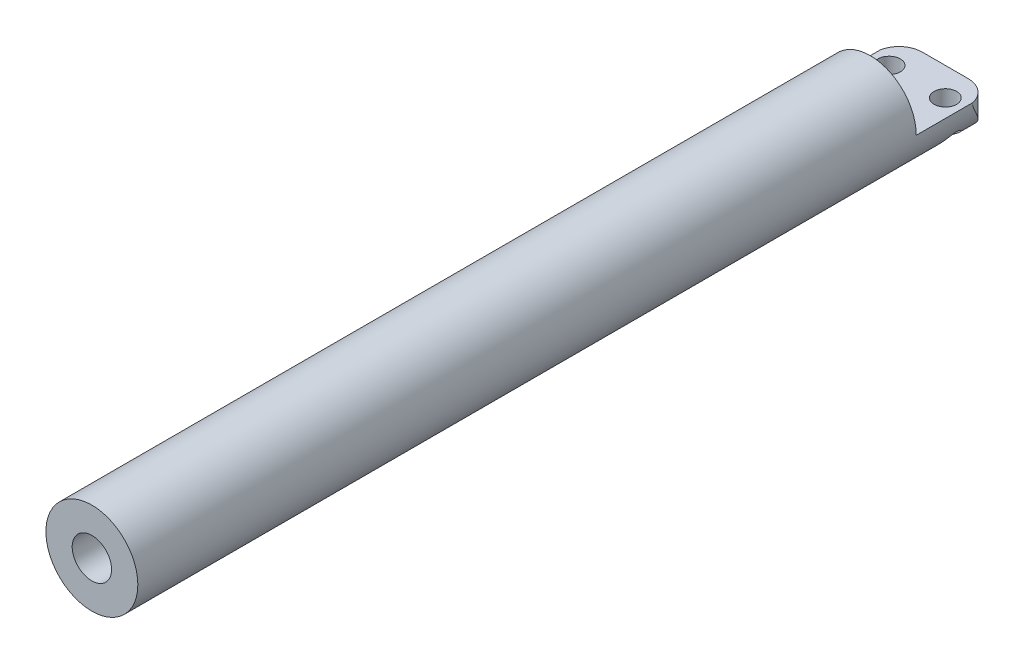
ISO-10303-21;
HEADER;
FILE_DESCRIPTION(('STEP AP214'),'2;1');
FILE_NAME('part.step','',(''),(''),'','','');
FILE_SCHEMA(('AUTOMOTIVE_DESIGN { 1 0 10303 214 1 1 1 1 }'));
ENDSEC;
DATA;
#1=APPLICATION_CONTEXT('core data for automotive mechanical design processes');
#2=APPLICATION_PROTOCOL_DEFINITION('international standard','automotive_design',2000,#1);
#3=PRODUCT_CONTEXT('',#1,'mechanical');
#4=PRODUCT('Part','Part','',(#3));
#5=PRODUCT_RELATED_PRODUCT_CATEGORY('part','',(#4));
#6=PRODUCT_DEFINITION_FORMATION('','',#4);
#7=PRODUCT_DEFINITION_CONTEXT('part definition',#1,'design');
#8=PRODUCT_DEFINITION('design','',#6,#7);
#9=PRODUCT_DEFINITION_SHAPE('','',#8);
#10=(LENGTH_UNIT() NAMED_UNIT(*) SI_UNIT(.MILLI.,.METRE.));
#11=(NAMED_UNIT(*) PLANE_ANGLE_UNIT() SI_UNIT($,.RADIAN.));
#12=(NAMED_UNIT(*) SI_UNIT($,.STERADIAN.) SOLID_ANGLE_UNIT());
#13=UNCERTAINTY_MEASURE_WITH_UNIT(LENGTH_MEASURE(1.E-05),#10,'distance_accuracy_value','');
#14=(GEOMETRIC_REPRESENTATION_CONTEXT(3) GLOBAL_UNCERTAINTY_ASSIGNED_CONTEXT((#13)) GLOBAL_UNIT_ASSIGNED_CONTEXT((#10,
#11,#12)) REPRESENTATION_CONTEXT('',''));
#15=CARTESIAN_POINT('',(0.,0.,0.));
#16=DIRECTION('',(0.,0.,1.));
#17=DIRECTION('',(1.,0.,0.));
#18=AXIS2_PLACEMENT_3D('',#15,#16,#17);
#19=CARTESIAN_POINT('',(5.,0.,8.));
#20=DIRECTION('',(0.,-1.,0.));
#21=DIRECTION('',(0.,0.,-1.));
#22=AXIS2_PLACEMENT_3D('',#19,#20,#21);
#23=PLANE('',#22);
#24=CARTESIAN_POINT('',(3.,0.,3.));
#25=DIRECTION('',(0.,1.,0.));
#26=DIRECTION('',(0.,0.,1.));
#27=AXIS2_PLACEMENT_3D('',#24,#25,#26);
#28=CIRCLE('',#27,1.2);
#29=CARTESIAN_POINT('',(3.,0.,4.2));
#30=VERTEX_POINT('',#29);
#31=EDGE_CURVE('E129',#30,#30,#28,.T.);
#32=ORIENTED_EDGE('',*,*,#31,.F.);
#33=EDGE_LOOP('',(#32));
#34=FACE_BOUND('',#33,.T.);
#35=DIRECTION('',(1.,0.,0.));
#36=VECTOR('',#35,1.);
#37=CARTESIAN_POINT('',(0.,0.,0.));
#38=LINE('',#37,#36);
#39=CARTESIAN_POINT('',(-2.45,0.,0.));
#40=VERTEX_POINT('',#39);
#41=CARTESIAN_POINT('',(2.45,0.,0.));
#42=VERTEX_POINT('',#41);
#43=EDGE_CURVE('E60',#40,#42,#38,.T.);
#44=ORIENTED_EDGE('',*,*,#43,.F.);
#45=CARTESIAN_POINT('',(-2.45,0.,2.5));
#46=DIRECTION('',(0.,-1.,0.));
#47=DIRECTION('',(0.,0.,-1.));
#48=AXIS2_PLACEMENT_3D('',#45,#46,#47);
#49=CIRCLE('',#48,2.5);
#50=CARTESIAN_POINT('',(-4.9,0.,2.00250628144669));
#51=VERTEX_POINT('',#50);
#52=EDGE_CURVE('E94',#51,#40,#49,.T.);
#53=ORIENTED_EDGE('',*,*,#52,.F.);
#54=DIRECTION('',(0.,0.,-1.));
#55=VECTOR('',#54,1.);
#56=CARTESIAN_POINT('',(-4.9,0.,91.));
#57=LINE('',#56,#55);
#58=CARTESIAN_POINT('',(-4.9,0.,8.00000000000001));
#59=VERTEX_POINT('',#58);
#60=EDGE_CURVE('E163',#59,#51,#57,.T.);
#61=ORIENTED_EDGE('',*,*,#60,.F.);
#62=DIRECTION('',(-1.,0.,0.));
#63=VECTOR('',#62,1.);
#64=CARTESIAN_POINT('',(5.,0.,8.));
#65=LINE('',#64,#63);
#66=CARTESIAN_POINT('',(4.9,0.,8.00000000000001));
#67=VERTEX_POINT('',#66);
#68=EDGE_CURVE('E151',#67,#59,#65,.T.);
#69=ORIENTED_EDGE('',*,*,#68,.F.);
#70=DIRECTION('',(0.,0.,-1.));
#71=VECTOR('',#70,1.);
#72=CARTESIAN_POINT('',(4.9,0.,91.));
#73=LINE('',#72,#71);
#74=CARTESIAN_POINT('',(4.9,0.,2.0025062814467));
#75=VERTEX_POINT('',#74);
#76=EDGE_CURVE('E160',#75,#67,#73,.F.);
#77=ORIENTED_EDGE('',*,*,#76,.F.);
#78=CARTESIAN_POINT('',(2.45,0.,2.5));
#79=DIRECTION('',(0.,-1.,0.));
#80=DIRECTION('',(0.,0.,-1.));
#81=AXIS2_PLACEMENT_3D('',#78,#79,#80);
#82=CIRCLE('',#81,2.5);
#83=EDGE_CURVE('E114',#42,#75,#82,.T.);
#84=ORIENTED_EDGE('',*,*,#83,.F.);
#85=EDGE_LOOP('',(#44,#53,#61,#69,#77,#84));
#86=FACE_BOUND('',#85,.T.);
#87=CARTESIAN_POINT('',(-3.,0.,3.));
#88=DIRECTION('',(0.,1.,0.));
#89=DIRECTION('',(0.,0.,1.));
#90=AXIS2_PLACEMENT_3D('',#87,#88,#89);
#91=CIRCLE('',#90,1.2);
#92=CARTESIAN_POINT('',(-3.,0.,4.2));
#93=VERTEX_POINT('',#92);
#94=EDGE_CURVE('E223',#93,#93,#91,.T.);
#95=ORIENTED_EDGE('',*,*,#94,.F.);
#96=EDGE_LOOP('',(#95));
#97=FACE_BOUND('',#96,.T.);
#98=ADVANCED_FACE('F45',(#34,#86,#97),#23,.F.);
#99=CARTESIAN_POINT('',(0.,0.,0.));
#100=DIRECTION('',(0.,0.,1.));
#101=DIRECTION('',(1.,0.,0.));
#102=AXIS2_PLACEMENT_3D('',#99,#100,#101);
#103=PLANE('',#102);
#104=DIRECTION('',(0.,1.,0.));
#105=VECTOR('',#104,1.);
#106=CARTESIAN_POINT('',(-2.45,-4.9,0.));
#107=LINE('',#106,#105);
#108=CARTESIAN_POINT('',(-2.45,-4.24352447854375,0.));
#109=VERTEX_POINT('',#108);
#110=EDGE_CURVE('E97',#109,#40,#107,.T.);
#111=ORIENTED_EDGE('',*,*,#110,.T.);
#112=ORIENTED_EDGE('',*,*,#43,.T.);
#113=DIRECTION('',(0.,1.,0.));
#114=VECTOR('',#113,1.);
#115=CARTESIAN_POINT('',(2.45,-4.9,0.));
#116=LINE('',#115,#114);
#117=CARTESIAN_POINT('',(2.45,-4.24352447854375,0.));
#118=VERTEX_POINT('',#117);
#119=EDGE_CURVE('E76',#118,#42,#116,.T.);
#120=ORIENTED_EDGE('',*,*,#119,.F.);
#121=CARTESIAN_POINT('',(0.,0.,0.));
#122=DIRECTION('',(0.,0.,1.));
#123=DIRECTION('',(1.,0.,0.));
#124=AXIS2_PLACEMENT_3D('',#121,#122,#123);
#125=CIRCLE('',#124,4.9);
#126=EDGE_CURVE('E108',#109,#118,#125,.T.);
#127=ORIENTED_EDGE('',*,*,#126,.F.);
#128=EDGE_LOOP('',(#111,#112,#120,#127));
#129=FACE_BOUND('',#128,.T.);
#130=ADVANCED_FACE('F106',(#129),#103,.F.);
#131=CARTESIAN_POINT('',(0.,0.,91.));
#132=DIRECTION('',(0.,0.,-1.));
#133=DIRECTION('',(-1.,0.,0.));
#134=AXIS2_PLACEMENT_3D('',#131,#132,#133);
#135=CYLINDRICAL_SURFACE('',#134,4.9);
#136=CARTESIAN_POINT('',(-3.,-3.87427412556211,4.2));
#137=CARTESIAN_POINT('',(-2.91894319230574,-3.93703894208136,4.20000005116718));
#138=CARTESIAN_POINT('',(-2.83585725052486,-3.99727138144049,4.19180123097966));
#139=CARTESIAN_POINT('',(-2.66884426469863,-4.1106421312578,4.15653426329772));
#140=CARTESIAN_POINT('',(-2.58491953907667,-4.16379612844909,4.1295086960665));
#141=CARTESIAN_POINT('',(-2.44554988663214,-4.24662262416049,4.06610566093395));
#142=CARTESIAN_POINT('',(-2.38907540609704,-4.27857057943195,4.03492044222271));
#143=CARTESIAN_POINT('',(-2.28021240888101,-4.33756262033138,3.96237900729422));
#144=CARTESIAN_POINT('',(-2.22782173934737,-4.36460929985309,3.92102819846337));
#145=CARTESIAN_POINT('',(-2.12922471820036,-4.41355373883355,3.82845851160823));
#146=CARTESIAN_POINT('',(-2.08304768738188,-4.43542743178192,3.77719545098181));
#147=CARTESIAN_POINT('',(-1.99947023195381,-4.47372782754513,3.66615567480207));
#148=CARTESIAN_POINT('',(-1.96206811020355,-4.49015558390385,3.60638060914139));
#149=CARTESIAN_POINT('',(-1.90064575916992,-4.51647801721775,3.48542579725053));
#150=CARTESIAN_POINT('',(-1.87577598336144,-4.52679991937303,3.42476895091964));
#151=CARTESIAN_POINT('',(-1.83617206748828,-4.54300943211008,3.29967447676053));
#152=CARTESIAN_POINT('',(-1.82143511467273,-4.54889827329981,3.23523790353405));
#153=CARTESIAN_POINT('',(-1.80312853798517,-4.55618484085379,3.10726649978699));
#154=CARTESIAN_POINT('',(-1.79912560716684,-4.55775689203799,3.04380311221458));
#155=CARTESIAN_POINT('',(-1.80119335927167,-4.55694021470691,2.91706969172011));
#156=CARTESIAN_POINT('',(-1.80726293067784,-4.55455192322189,2.8537996382352));
#157=CARTESIAN_POINT('',(-1.82912526400739,-4.54581515503182,2.72985967378321));
#158=CARTESIAN_POINT('',(-1.84482706689199,-4.53950371803653,2.66917105250077));
#159=CARTESIAN_POINT('',(-1.88524159149435,-4.52286836726616,2.55146272782724));
#160=CARTESIAN_POINT('',(-1.90995404930511,-4.51254457100577,2.49444291704037));
#161=CARTESIAN_POINT('',(-1.96766221214069,-4.48768276618114,2.38507165821778));
#162=CARTESIAN_POINT('',(-2.00073233039107,-4.47310670695859,2.33276820376856));
#163=CARTESIAN_POINT('',(-2.07369865066958,-4.43974986032653,2.23468722320652));
#164=CARTESIAN_POINT('',(-2.11359537837127,-4.42096874907845,2.18891020015047));
#165=CARTESIAN_POINT('',(-2.20022491935629,-4.37851742829536,2.10322482264729));
#166=CARTESIAN_POINT('',(-2.24715419742306,-4.35469369806591,2.06359189605251));
#167=CARTESIAN_POINT('',(-2.34489168390561,-4.30285298835708,1.99278643218186));
#168=CARTESIAN_POINT('',(-2.39570090905638,-4.27483490789369,1.96161612233888));
#169=CARTESIAN_POINT('',(-2.50394323549686,-4.21242096966201,1.90548867901903));
#170=CARTESIAN_POINT('',(-2.56157139565156,-4.17768474333821,1.88128981955732));
#171=CARTESIAN_POINT('',(-2.67755821287268,-4.10431507289855,1.84251241762814));
#172=CARTESIAN_POINT('',(-2.73591725443182,-4.06567949494166,1.82793917585243));
#173=CARTESIAN_POINT('',(-2.8606749148685,-3.97908695377834,1.80619076501843));
#174=CARTESIAN_POINT('',(-2.92695753114289,-3.93060322834648,1.8004641696216));
#175=CARTESIAN_POINT('',(-3.05699611157354,-3.83034380229779,1.79958947214933));
#176=CARTESIAN_POINT('',(-3.12075129362828,-3.77856709539524,1.80444461892108));
#177=CARTESIAN_POINT('',(-3.25756972377173,-3.66168167477498,1.82552539633807));
#178=CARTESIAN_POINT('',(-3.32983455209164,-3.59602866216794,1.84389302638762));
#179=CARTESIAN_POINT('',(-3.46834162568086,-3.46263981821649,1.89272126997221));
#180=CARTESIAN_POINT('',(-3.5345706989209,-3.39489984375281,1.92320758872699));
#181=CARTESIAN_POINT('',(-3.63530300512277,-3.28598610675153,1.98102974139632));
#182=CARTESIAN_POINT('',(-3.67198853775232,-3.24490876541021,2.00483713171172));
#183=CARTESIAN_POINT('',(-3.74274419435274,-3.16303462657827,2.0564696751072));
#184=CARTESIAN_POINT('',(-3.77681509337203,-3.1222377492406,2.0842936304674));
#185=CARTESIAN_POINT('',(-3.84212726018961,-3.04150441133421,2.14397680221198));
#186=CARTESIAN_POINT('',(-3.87337392361417,-3.00156642615875,2.17582803266554));
#187=CARTESIAN_POINT('',(-3.93286434576907,-2.92318201536295,2.24382285441116));
#188=CARTESIAN_POINT('',(-3.96111082374422,-2.88473425948738,2.27996249485316));
#189=CARTESIAN_POINT('',(-4.01232772500763,-2.81300991666482,2.35418550865248));
#190=CARTESIAN_POINT('',(-4.03553224425234,-2.77956052905598,2.39193768218171));
#191=CARTESIAN_POINT('',(-4.0785529536903,-2.71603965789004,2.47199727583275));
#192=CARTESIAN_POINT('',(-4.0983712731116,-2.68596605576517,2.51430180597117));
#193=CARTESIAN_POINT('',(-4.13086980905536,-2.63565199417995,2.59657111385787));
#194=CARTESIAN_POINT('',(-4.14418765001887,-2.61460775937328,2.63578162392659));
#195=CARTESIAN_POINT('',(-4.16709039770135,-2.57795010788273,2.71769395378718));
#196=CARTESIAN_POINT('',(-4.17668311889779,-2.56232532981767,2.76038823505305));
#197=CARTESIAN_POINT('',(-4.18962820841895,-2.54108952922403,2.83877612464222));
#198=CARTESIAN_POINT('',(-4.19389332322885,-2.53402526257945,2.87391879647768));
#199=CARTESIAN_POINT('',(-4.19927244021785,-2.52510198069445,2.94509049809449));
#200=CARTESIAN_POINT('',(-4.20038945806425,-2.52323798395897,2.98111864624471));
#201=CARTESIAN_POINT('',(-4.19936778151055,-2.52493775739384,3.05301626390913));
#202=CARTESIAN_POINT('',(-4.19722719513464,-2.52850468177588,3.0888856290675));
#203=CARTESIAN_POINT('',(-4.18989057196289,-2.54064274093599,3.15944635655077));
#204=CARTESIAN_POINT('',(-4.1846913081904,-2.54921916078152,3.19413643375148));
#205=CARTESIAN_POINT('',(-4.16929611469619,-2.57434518939374,3.27372493798174));
#206=CARTESIAN_POINT('',(-4.15797889571629,-2.59264834396757,3.317845163586));
#207=CARTESIAN_POINT('',(-4.13147489908584,-2.63467944342404,3.40215578782995));
#208=CARTESIAN_POINT('',(-4.11627833806198,-2.65842108794419,3.44233588986658));
#209=CARTESIAN_POINT('',(-4.07204112004904,-2.7259813117342,3.54356030021408));
#210=CARTESIAN_POINT('',(-4.04038765079597,-2.77288251057112,3.60137581169563));
#211=CARTESIAN_POINT('',(-3.97078296128257,-2.87168528805593,3.70827787793948));
#212=CARTESIAN_POINT('',(-3.93281406548323,-2.92360072449348,3.75733910918079));
#213=CARTESIAN_POINT('',(-3.86130766271513,-3.01709970669626,3.83682108860561));
#214=CARTESIAN_POINT('',(-3.82889967623743,-3.05816618149949,3.86888746754464));
#215=CARTESIAN_POINT('',(-3.7612126692087,-3.14104300949098,3.92876175619676));
#216=CARTESIAN_POINT('',(-3.72593223693857,-3.18285372046467,3.95656755238033));
#217=CARTESIAN_POINT('',(-3.61607167706204,-3.30852584273501,4.03366655739079));
#218=CARTESIAN_POINT('',(-3.53737913727735,-3.39275115756542,4.07674315841821));
#219=CARTESIAN_POINT('',(-3.38425034701718,-3.54492944931914,4.13929589508668));
#220=CARTESIAN_POINT('',(-3.31128423083506,-3.61325831801122,4.16150617637717));
#221=CARTESIAN_POINT('',(-3.1595495699747,-3.74665404155835,4.19185642570665));
#222=CARTESIAN_POINT('',(-3.08078249669078,-3.81172171661592,4.19999994900598));
#223=CARTESIAN_POINT('',(-3.,-3.87427412556211,4.2));
#224=B_SPLINE_CURVE_WITH_KNOTS('',3,(#136,#137,#138,#139,#140,#141,#142,#143,#144,#145,#146,
#147,#148,#149,#150,#151,#152,#153,#154,#155,#156,#157,#158,#159,#160,#161,#162,#163,#164,#165,
#166,#167,#168,#169,#170,#171,#172,#173,#174,#175,#176,#177,#178,#179,#180,#181,#182,#183,#184,
#185,#186,#187,#188,#189,#190,#191,#192,#193,#194,#195,#196,#197,#198,#199,#200,#201,#202,#203,
#204,#205,#206,#207,#208,#209,#210,#211,#212,#213,#214,#215,#216,#217,#218,#219,#220,#221,#222,
#223),.UNSPECIFIED.,.T.,.F.,(4,2,2,2,2,2,2,2,2,2,2,2,2,2,2,2,2,2,2,2,2,2,2,2,2,2,2,2,2,2,2,2,2,
2,2,2,2,2,2,2,2,2,2,4),(0.,0.307170967446051,0.613649455443194,0.8287323111983,1.04370100446146,
1.25965095245849,1.47555909943732,1.67365157254986,1.87168903532938,2.06160260155836,
2.2514952119102,2.43962165862984,2.62774259588358,2.81760143196876,3.00747489445377,
3.20428358245072,3.40114402206238,3.61482212204078,3.82861779364279,4.07468175591704,
4.32082127633762,4.61781564999811,4.91544337553835,5.0952772710543,5.27505765134011,
5.45448696654532,5.6337522411303,5.80001279483082,5.96616841676184,6.1050721485401,
6.24368289625694,6.35151115216559,6.45923608061749,6.56702359824286,6.67492503869311,
6.8213574189653,6.96816280186745,7.20951660617485,7.45155763969488,7.63540287253664,
7.81933901150218,8.18666135813135,8.49287020622753,8.79900165116191),.UNSPECIFIED.);
#225=CARTESIAN_POINT('',(-3.,-3.87427412556211,4.2));
#226=VERTEX_POINT('',#225);
#227=EDGE_CURVE('E50',#226,#226,#224,.T.);
#228=ORIENTED_EDGE('',*,*,#227,.T.);
#229=EDGE_LOOP('',(#228));
#230=FACE_BOUND('',#229,.T.);
#231=CARTESIAN_POINT('',(3.,-3.8742741255621,4.2));
#232=CARTESIAN_POINT('',(3.08029401161625,-3.81209543093405,4.20000034014652));
#233=CARTESIAN_POINT('',(3.15865368673556,-3.74739481534197,4.19194837608926));
#234=CARTESIAN_POINT('',(3.3097373852026,-3.6146644807967,4.16190163261985));
#235=CARTESIAN_POINT('',(3.38245169767743,-3.54662934005454,4.13988340054288));
#236=CARTESIAN_POINT('',(3.52793539608425,-3.40222950792458,4.08075817666281));
#237=CARTESIAN_POINT('',(3.60002450275473,-3.32569749652787,4.04239362743198));
#238=CARTESIAN_POINT('',(3.73532226529907,-3.17297066049489,3.95181022319879));
#239=CARTESIAN_POINT('',(3.79853420661298,-3.09677572127355,3.89959651454928));
#240=CARTESIAN_POINT('',(3.89745577038225,-2.97055723229464,3.79871253244432));
#241=CARTESIAN_POINT('',(3.93571073895858,-2.91957022269414,3.75372156050752));
#242=CARTESIAN_POINT('',(4.00669825417587,-2.82134777868147,3.65590508874435));
#243=CARTESIAN_POINT('',(4.03943969824603,-2.77410636631574,3.60309247506956));
#244=CARTESIAN_POINT('',(4.08783531616308,-2.70199796625347,3.50830628036876));
#245=CARTESIAN_POINT('',(4.10547469152316,-2.67505851479824,3.46893852358465));
#246=CARTESIAN_POINT('',(4.13709428526058,-2.62589014492219,3.3859792539165));
#247=CARTESIAN_POINT('',(4.15108067049547,-2.60365329995567,3.34239503188358));
#248=CARTESIAN_POINT('',(4.1715504680159,-2.57069077431611,3.26218438199564));
#249=CARTESIAN_POINT('',(4.17903085096306,-2.55848131530613,3.22643344951474));
#250=CARTESIAN_POINT('',(4.19077492844687,-2.5391996494995,3.15306698792748));
#251=CARTESIAN_POINT('',(4.19504324852174,-2.53212005597666,3.11545422352712));
#252=CARTESIAN_POINT('',(4.19997687583845,-2.52392950372323,3.03907288537));
#253=CARTESIAN_POINT('',(4.2006184331558,-2.52285788872902,3.00029836071458));
#254=CARTESIAN_POINT('',(4.19816186255342,-2.52694305217911,2.92319611174113));
#255=CARTESIAN_POINT('',(4.19506168445216,-2.53210324517299,2.88486864399773));
#256=CARTESIAN_POINT('',(4.18487670038458,-2.54890384761461,2.80543199332854));
#257=CARTESIAN_POINT('',(4.17736466386615,-2.56123741397074,2.76452864679813));
#258=CARTESIAN_POINT('',(4.158796986287,-2.59127740295743,2.68560884936631));
#259=CARTESIAN_POINT('',(4.14773446197969,-2.60899425845976,2.64759818499134));
#260=CARTESIAN_POINT('',(4.11590422645581,-2.65906301650473,2.5546601192218));
#261=CARTESIAN_POINT('',(4.09314176843861,-2.69411136984665,2.50189317992721));
#262=CARTESIAN_POINT('',(4.04248662753396,-2.76954589342526,2.40307649852652));
#263=CARTESIAN_POINT('',(4.01457964047652,-2.80994685603532,2.35704614371809));
#264=CARTESIAN_POINT('',(3.95967788492703,-2.88665666020806,2.27825993584587));
#265=CARTESIAN_POINT('',(3.93333430012126,-2.9224938568744,2.24457762521559));
#266=CARTESIAN_POINT('',(3.87804063899718,-2.99548059145864,2.18096347346174));
#267=CARTESIAN_POINT('',(3.84908897268007,-3.03263092141911,2.15103394715345));
#268=CARTESIAN_POINT('',(3.75858001375491,-3.145204868798,2.06651797268458));
#269=CARTESIAN_POINT('',(3.69337807448052,-3.22173818085064,2.01721708718196));
#270=CARTESIAN_POINT('',(3.55145724456577,-3.3776846700294,1.93085812109448));
#271=CARTESIAN_POINT('',(3.4743770862964,-3.45708799204735,1.89438138886364));
#272=CARTESIAN_POINT('',(3.31181623494424,-3.61310156443419,1.83804278502768));
#273=CARTESIAN_POINT('',(3.22634813542747,-3.68971577223398,1.81815641875024));
#274=CARTESIAN_POINT('',(3.06663453138492,-3.82286666311273,1.79972598434529));
#275=CARTESIAN_POINT('',(2.99358044311198,-3.8803463414999,1.79769891648557));
#276=CARTESIAN_POINT('',(2.84491454405354,-3.99061143916833,1.8077413813));
#277=CARTESIAN_POINT('',(2.76930593356559,-4.04340245183973,1.81979386781202));
#278=CARTESIAN_POINT('',(2.63092269779273,-4.13447962474159,1.85631982669513));
#279=CARTESIAN_POINT('',(2.56813198170949,-4.1737110652616,1.87835850838576));
#280=CARTESIAN_POINT('',(2.4447446618623,-4.24715989701134,1.93404292549753));
#281=CARTESIAN_POINT('',(2.38414735213289,-4.2813789125309,1.96768488893635));
#282=CARTESIAN_POINT('',(2.26740933587002,-4.34433964494003,2.04694340893176));
#283=CARTESIAN_POINT('',(2.21129929631278,-4.37304528704025,2.0926344799132));
#284=CARTESIAN_POINT('',(2.10694234981461,-4.42427186512402,2.19514799622031));
#285=CARTESIAN_POINT('',(2.05869149998859,-4.44679590627046,2.25196482814724));
#286=CARTESIAN_POINT('',(1.9777912580084,-4.48331234335294,2.36793646346695));
#287=CARTESIAN_POINT('',(1.9439865360377,-4.49798746241129,2.42607345587645));
#288=CARTESIAN_POINT('',(1.88632835259946,-4.52247194167801,2.54802863389412));
#289=CARTESIAN_POINT('',(1.86247089625175,-4.5322832555188,2.61184452630416));
#290=CARTESIAN_POINT('',(1.82702308253782,-4.54668340496262,2.73886309629125));
#291=CARTESIAN_POINT('',(1.81474161782269,-4.551567899346,2.80184055470478));
#292=CARTESIAN_POINT('',(1.80038499451117,-4.55726625131094,2.92912612841131));
#293=CARTESIAN_POINT('',(1.79830809333312,-4.55808080389627,2.99343401463027));
#294=CARTESIAN_POINT('',(1.80438511766255,-4.55567811863927,3.12023934409444));
#295=CARTESIAN_POINT('',(1.81234273238644,-4.55253824490808,3.18274779928398));
#296=CARTESIAN_POINT('',(1.83783344392526,-4.54230721225471,3.30544068654007));
#297=CARTESIAN_POINT('',(1.85536605488324,-4.53521625381915,3.36562523636093));
#298=CARTESIAN_POINT('',(1.8993412248719,-4.51697537198676,3.48211329265415));
#299=CARTESIAN_POINT('',(1.92580009208096,-4.50581801630566,3.53840946666019));
#300=CARTESIAN_POINT('',(1.98654679121136,-4.47936656023999,3.64552653851655));
#301=CARTESIAN_POINT('',(2.02083472755959,-4.46407240467682,3.69634736332142));
#302=CARTESIAN_POINT('',(2.09675519524313,-4.42892787015135,3.79245560939518));
#303=CARTESIAN_POINT('',(2.13854048816487,-4.40897946894962,3.83758617230608));
#304=CARTESIAN_POINT('',(2.22722978372662,-4.36484808451045,3.92005235640736));
#305=CARTESIAN_POINT('',(2.27413486493304,-4.34066420835033,3.95738633027524));
#306=CARTESIAN_POINT('',(2.37444078064016,-4.286661902678,4.02596084152474));
#307=CARTESIAN_POINT('',(2.42806469864344,-4.25658440547127,4.0566689939238));
#308=CARTESIAN_POINT('',(2.53730851399873,-4.19238410334429,4.10886729437353));
#309=CARTESIAN_POINT('',(2.59292902498088,-4.158260047208,4.13035458175162));
#310=CARTESIAN_POINT('',(2.70775245480676,-4.08448158223328,4.16550356804713));
#311=CARTESIAN_POINT('',(2.76697964206467,-4.04462328294602,4.17865232515285));
#312=CARTESIAN_POINT('',(2.88446624609577,-3.96169668231821,4.19590237742974));
#313=CARTESIAN_POINT('',(2.94272523325808,-3.91862700019689,4.19999975736905));
#314=CARTESIAN_POINT('',(3.,-3.8742741255621,4.2));
#315=B_SPLINE_CURVE_WITH_KNOTS('',3,(#231,#232,#233,#234,#235,#236,#237,#238,#239,#240,#241,
#242,#243,#244,#245,#246,#247,#248,#249,#250,#251,#252,#253,#254,#255,#256,#257,#258,#259,#260,
#261,#262,#263,#264,#265,#266,#267,#268,#269,#270,#271,#272,#273,#274,#275,#276,#277,#278,#279,
#280,#281,#282,#283,#284,#285,#286,#287,#288,#289,#290,#291,#292,#293,#294,#295,#296,#297,#298,
#299,#300,#301,#302,#303,#304,#305,#306,#307,#308,#309,#310,#311,#312,#313,#314),.UNSPECIFIED.,
.T.,.F.,(4,2,2,2,2,2,2,2,2,2,2,2,2,2,2,2,2,2,2,2,2,2,2,2,2,2,2,2,2,2,2,2,2,2,2,2,2,2,2,2,2,4),
(0.,0.304419972637567,0.609352496585275,0.943894977585928,1.27831331621934,1.51188892452681,
1.74508391186346,1.89728932419934,2.04923610284688,2.16433861872038,2.2792750620946,
2.39496330470807,2.51071496431526,2.64013284051597,2.76980314720873,2.97061696544059,
3.17199779938875,3.33914978794049,3.50640437823084,3.84097510738331,4.18919166705855,
4.53689319157126,4.81479454279972,5.09235978636246,5.32316105658555,5.55388736878634,
5.78607544214613,6.0181466676298,6.22356675601705,6.42890426684473,6.62101688878945,
6.8130967034937,7.00147638953361,7.18984651765022,7.37856267676796,7.56728135319544,
7.76040529142772,7.95356999315927,8.15890979418428,8.36431325366384,8.58136612515845,
8.79851286591079),.UNSPECIFIED.);
#316=CARTESIAN_POINT('',(3.,-3.8742741255621,4.2));
#317=VERTEX_POINT('',#316);
#318=EDGE_CURVE('E122',#317,#317,#315,.T.);
#319=ORIENTED_EDGE('',*,*,#318,.T.);
#320=EDGE_LOOP('',(#319));
#321=FACE_BOUND('',#320,.T.);
#322=CARTESIAN_POINT('',(0.,0.,91.));
#323=DIRECTION('',(0.,0.,1.));
#324=DIRECTION('',(1.,0.,0.));
#325=AXIS2_PLACEMENT_3D('',#322,#323,#324);
#326=CIRCLE('',#325,4.9);
#327=CARTESIAN_POINT('',(4.9,0.,91.));
#328=VERTEX_POINT('',#327);
#329=EDGE_CURVE('E116',#328,#328,#326,.T.);
#330=ORIENTED_EDGE('',*,*,#329,.F.);
#331=EDGE_LOOP('',(#330));
#332=FACE_BOUND('',#331,.T.);
#333=ORIENTED_EDGE('',*,*,#60,.T.);
#334=CARTESIAN_POINT('',(-4.9,0.,2.0025062814467));
#335=CARTESIAN_POINT('',(-4.90000556065781,-0.0378187681741099,2.00257911082401));
#336=CARTESIAN_POINT('',(-4.89956250368469,-0.0755745786032973,2.00034931964881));
#337=CARTESIAN_POINT('',(-4.89783107814846,-0.150432496507789,1.99191262520152));
#338=CARTESIAN_POINT('',(-4.89654707932557,-0.187536970617807,1.98572628500967));
#339=CARTESIAN_POINT('',(-4.89321190903408,-0.260368231638872,1.97011987955992));
#340=CARTESIAN_POINT('',(-4.89117346444097,-0.296107590990815,1.96075366159133));
#341=CARTESIAN_POINT('',(-4.88637922648787,-0.366812742082446,1.93948283692182));
#342=CARTESIAN_POINT('',(-4.88362243188157,-0.40177737960784,1.92757469146888));
#343=CARTESIAN_POINT('',(-4.87148169806141,-0.537622939133123,1.87720429080218));
#344=CARTESIAN_POINT('',(-4.85956655379192,-0.63564771858297,1.83180282189697));
#345=CARTESIAN_POINT('',(-4.8305567932521,-0.827741998927642,1.73476820379137));
#346=CARTESIAN_POINT('',(-4.81344969285037,-0.921801337032413,1.68312021682083));
#347=CARTESIAN_POINT('',(-4.77376937752847,-1.10926572565132,1.57619638218655));
#348=CARTESIAN_POINT('',(-4.75109345227172,-1.20261985316768,1.52086856119421));
#349=CARTESIAN_POINT('',(-4.70048086126002,-1.38731123058661,1.40954905486917));
#350=CARTESIAN_POINT('',(-4.67255005957093,-1.47865060307894,1.35355817410723));
#351=CARTESIAN_POINT('',(-4.5961191807792,-1.7047487267428,1.21421586898528));
#352=CARTESIAN_POINT('',(-4.54429294682562,-1.83854098643578,1.1310871142022));
#353=CARTESIAN_POINT('',(-4.42819718992264,-2.10283196419191,0.968081260253986));
#354=CARTESIAN_POINT('',(-4.363918673074,-2.23332822418167,0.888206562167163));
#355=CARTESIAN_POINT('',(-4.22294718983162,-2.48956663175685,0.734365324265328));
#356=CARTESIAN_POINT('',(-4.14634644927922,-2.61533613814375,0.660360561461452));
#357=CARTESIAN_POINT('',(-3.97998233978338,-2.86214324964053,0.519848533241593));
#358=CARTESIAN_POINT('',(-3.89022999307804,-2.98318471072488,0.45333507120003));
#359=CARTESIAN_POINT('',(-3.67774156950639,-3.24310959917855,0.317899146250395));
#360=CARTESIAN_POINT('',(-3.55199933972218,-3.38071455262972,0.251159542929593));
#361=CARTESIAN_POINT('',(-3.2810952236416,-3.64415696282402,0.137642571786041));
#362=CARTESIAN_POINT('',(-3.13599667297245,-3.77003061540654,0.0908020998678496));
#363=CARTESIAN_POINT('',(-2.89831948748289,-3.95232826413879,0.0390343566678932));
#364=CARTESIAN_POINT('',(-2.81195298070453,-4.01425332245867,0.024734386048503));
#365=CARTESIAN_POINT('',(-2.63438034379824,-4.13298264151104,0.00520324003111501));
#366=CARTESIAN_POINT('',(-2.54315874606574,-4.18976876097348,3.08816464852921E-06));
#367=CARTESIAN_POINT('',(-2.45,-4.24352447854375,0.));
#368=B_SPLINE_CURVE_WITH_KNOTS('',3,(#334,#335,#336,#337,#338,#339,#340,#341,#342,#343,#344,
#345,#346,#347,#348,#349,#350,#351,#352,#353,#354,#355,#356,#357,#358,#359,#360,#361,#362,#363,
#364,#365,#366,#367),.UNSPECIFIED.,.F.,.F.,(4,2,2,2,2,2,2,2,2,2,2,2,2,2,2,2,4),(0.,
0.113287945607553,0.225991840513201,0.336875269053001,0.447914082945231,0.772991806485276,
1.09885746143025,1.43125616632272,1.76328611488028,2.26022466511302,2.7575234859866,
3.25126003978164,3.74458513953301,4.336659246135,4.92684149313622,5.24797461976163,
5.57020045107228),.UNSPECIFIED.);
#369=EDGE_CURVE('E68',#51,#109,#368,.T.);
#370=ORIENTED_EDGE('',*,*,#369,.T.);
#371=ORIENTED_EDGE('',*,*,#126,.T.);
#372=CARTESIAN_POINT('',(2.45,-4.24352447854375,0.));
#373=CARTESIAN_POINT('',(2.54364038361634,-4.18950070315606,-1.070791847022E-06));
#374=CARTESIAN_POINT('',(2.63534797315865,-4.1323847627753,0.00525695672442928));
#375=CARTESIAN_POINT('',(2.8139102362447,-4.01289519073013,0.0250030571287486));
#376=CARTESIAN_POINT('',(2.90077681751919,-3.95053550111639,0.0394672864675345));
#377=CARTESIAN_POINT('',(3.06811740974007,-3.82199964555354,0.0761221976079122));
#378=CARTESIAN_POINT('',(3.14865729132197,-3.75588034093934,0.0982149248724149));
#379=CARTESIAN_POINT('',(3.30424258867172,-3.61976086093425,0.149048813770014));
#380=CARTESIAN_POINT('',(3.37928388404874,-3.54975784290962,0.177794895381995));
#381=CARTESIAN_POINT('',(3.53736221701605,-3.39289152354895,0.246905887134796));
#382=CARTESIAN_POINT('',(3.61921295109319,-3.30535021866623,0.288440521770886));
#383=CARTESIAN_POINT('',(3.77479778242698,-3.12649285115943,0.377980072996574));
#384=CARTESIAN_POINT('',(3.84853134059531,-3.03517653837797,0.425985418856971));
#385=CARTESIAN_POINT('',(3.98843263373724,-2.84886936091098,0.527504620152922));
#386=CARTESIAN_POINT('',(4.0545530434176,-2.75385995808725,0.581049375169639));
#387=CARTESIAN_POINT('',(4.17891646334811,-2.5612110566434,0.692292461633107));
#388=CARTESIAN_POINT('',(4.23716052347795,-2.46357191064018,0.749990237927878));
#389=CARTESIAN_POINT('',(4.36769897100824,-2.22667476006327,0.892176509341945));
#390=CARTESIAN_POINT('',(4.43635709580798,-2.08632134009908,0.978186848495879));
#391=CARTESIAN_POINT('',(4.55945522686567,-1.80152649543622,1.15400539067972));
#392=CARTESIAN_POINT('',(4.6138741908639,-1.65707936637769,1.24381898905333));
#393=CARTESIAN_POINT('',(4.68505917117692,-1.43740123513696,1.37879471565682));
#394=CARTESIAN_POINT('',(4.70703618107636,-1.36372209928683,1.42380027453799));
#395=CARTESIAN_POINT('',(4.74756874816044,-1.21512369631848,1.51329547257044));
#396=CARTESIAN_POINT('',(4.76612477503661,-1.14020460098485,1.55778518175927));
#397=CARTESIAN_POINT('',(4.7997895868582,-0.988946034446909,1.64520530315593));
#398=CARTESIAN_POINT('',(4.81490656495859,-0.912610417813499,1.68813921209595));
#399=CARTESIAN_POINT('',(4.84170164978444,-0.757694281599281,1.77086166125075));
#400=CARTESIAN_POINT('',(4.85338266678679,-0.679115724057099,1.81065284235132));
#401=CARTESIAN_POINT('',(4.87219129778733,-0.526400502213547,1.88020537901159));
#402=CARTESIAN_POINT('',(4.8796535947525,-0.452586280425346,1.91056812541834));
#403=CARTESIAN_POINT('',(4.8912800484492,-0.301640287835233,1.96071356156981));
#404=CARTESIAN_POINT('',(4.8954784149968,-0.224552113709987,1.98060526680717));
#405=CARTESIAN_POINT('',(4.89853917026673,-0.12206784342817,1.99535398009433));
#406=CARTESIAN_POINT('',(4.89908343733095,-0.097835427853497,1.99800867440466));
#407=CARTESIAN_POINT('',(4.89981538153997,-0.0490725994918868,2.00159623358294));
#408=CARTESIAN_POINT('',(4.90000059504394,-0.0245412820496154,2.00251720127345));
#409=CARTESIAN_POINT('',(4.9,0.,2.00250628144669));
#410=B_SPLINE_CURVE_WITH_KNOTS('',3,(#372,#373,#374,#375,#376,#377,#378,#379,#380,#381,#382,
#383,#384,#385,#386,#387,#388,#389,#390,#391,#392,#393,#394,#395,#396,#397,#398,#399,#400,#401,
#402,#403,#404,#405,#406,#407,#408,#409),.UNSPECIFIED.,.F.,.F.,(4,2,2,2,2,2,2,2,2,2,2,2,2,2,2,2,
2,2,4),(0.,0.323947028719925,0.647058447933519,0.96616638250675,1.2855110471272,
1.66547675350852,2.04546767945656,2.42770596876453,2.80989325721056,3.34421711388599,
3.87932617696134,4.14653866088759,4.41371442991079,4.68024685616416,4.94655287367731,
5.18668622052933,5.42426742398913,5.49735674200595,5.57094581064311),.UNSPECIFIED.);
#411=EDGE_CURVE('E110',#118,#75,#410,.T.);
#412=ORIENTED_EDGE('',*,*,#411,.T.);
#413=ORIENTED_EDGE('',*,*,#76,.T.);
#414=CARTESIAN_POINT('',(0.,0.,8.00000000000001));
#415=DIRECTION('',(0.,0.,-1.));
#416=DIRECTION('',(-1.,0.,0.));
#417=AXIS2_PLACEMENT_3D('',#414,#415,#416);
#418=CIRCLE('',#417,4.9);
#419=EDGE_CURVE('E11',#59,#67,#418,.T.);
#420=ORIENTED_EDGE('',*,*,#419,.F.);
#421=EDGE_LOOP('',(#333,#370,#371,#412,#413,#420));
#422=FACE_BOUND('',#421,.T.);
#423=ADVANCED_FACE('F47',(#230,#321,#332,#422),#135,.T.);
#424=CARTESIAN_POINT('',(0.,0.,91.));
#425=DIRECTION('',(0.,0.,1.));
#426=DIRECTION('',(1.,0.,0.));
#427=AXIS2_PLACEMENT_3D('',#424,#425,#426);
#428=PLANE('',#427);
#429=CARTESIAN_POINT('',(0.,0.,91.));
#430=DIRECTION('',(0.,0.,1.));
#431=DIRECTION('',(1.,0.,0.));
#432=AXIS2_PLACEMENT_3D('',#429,#430,#431);
#433=CIRCLE('',#432,2.1);
#434=CARTESIAN_POINT('',(2.1,0.,91.));
#435=VERTEX_POINT('',#434);
#436=EDGE_CURVE('E166',#435,#435,#433,.T.);
#437=ORIENTED_EDGE('',*,*,#436,.F.);
#438=EDGE_LOOP('',(#437));
#439=FACE_BOUND('',#438,.T.);
#440=ORIENTED_EDGE('',*,*,#329,.T.);
#441=EDGE_LOOP('',(#440));
#442=FACE_BOUND('',#441,.T.);
#443=ADVANCED_FACE('F201',(#439,#442),#428,.T.);
#444=CARTESIAN_POINT('',(0.,0.,78.2618072999579));
#445=DIRECTION('',(0.,0.,1.));
#446=DIRECTION('',(1.,0.,0.));
#447=AXIS2_PLACEMENT_3D('',#444,#445,#446);
#448=CONICAL_SURFACE('',#447,2.1,1.02974425867665);
#449=CARTESIAN_POINT('',(0.,0.,77.));
#450=VERTEX_POINT('',#449);
#451=VERTEX_LOOP('',#450);
#452=FACE_BOUND('',#451,.T.);
#453=CARTESIAN_POINT('',(0.,0.,78.2618072999579));
#454=DIRECTION('',(0.,0.,1.));
#455=DIRECTION('',(1.,0.,0.));
#456=AXIS2_PLACEMENT_3D('',#453,#454,#455);
#457=CIRCLE('',#456,2.1);
#458=CARTESIAN_POINT('',(2.1,0.,78.2618072999579));
#459=VERTEX_POINT('',#458);
#460=EDGE_CURVE('E170',#459,#459,#457,.T.);
#461=ORIENTED_EDGE('',*,*,#460,.T.);
#462=EDGE_LOOP('',(#461));
#463=FACE_BOUND('',#462,.T.);
#464=ADVANCED_FACE('F188',(#452,#463),#448,.F.);
#465=CARTESIAN_POINT('',(0.,0.,91.));
#466=DIRECTION('',(0.,0.,1.));
#467=DIRECTION('',(1.,0.,0.));
#468=AXIS2_PLACEMENT_3D('',#465,#466,#467);
#469=CYLINDRICAL_SURFACE('',#468,2.1);
#470=ORIENTED_EDGE('',*,*,#460,.F.);
#471=EDGE_LOOP('',(#470));
#472=FACE_BOUND('',#471,.T.);
#473=ORIENTED_EDGE('',*,*,#436,.T.);
#474=EDGE_LOOP('',(#473));
#475=FACE_BOUND('',#474,.T.);
#476=ADVANCED_FACE('F183',(#472,#475),#469,.F.);
#477=CARTESIAN_POINT('',(0.,0.,8.));
#478=DIRECTION('',(0.,0.,-1.));
#479=DIRECTION('',(-1.,0.,0.));
#480=AXIS2_PLACEMENT_3D('',#477,#478,#479);
#481=PLANE('',#480);
#482=ORIENTED_EDGE('',*,*,#419,.T.);
#483=ORIENTED_EDGE('',*,*,#68,.T.);
#484=EDGE_LOOP('',(#482,#483));
#485=FACE_BOUND('',#484,.T.);
#486=ADVANCED_FACE('F181',(#485),#481,.T.);
#487=CARTESIAN_POINT('',(2.45,-4.9,2.5));
#488=DIRECTION('',(0.,1.,0.));
#489=DIRECTION('',(0.,0.,1.));
#490=AXIS2_PLACEMENT_3D('',#487,#488,#489);
#491=CYLINDRICAL_SURFACE('',#490,2.5);
#492=ORIENTED_EDGE('',*,*,#119,.T.);
#493=ORIENTED_EDGE('',*,*,#83,.T.);
#494=ORIENTED_EDGE('',*,*,#411,.F.);
#495=EDGE_LOOP('',(#492,#493,#494));
#496=FACE_BOUND('',#495,.T.);
#497=ADVANCED_FACE('F140',(#496),#491,.T.);
#498=CARTESIAN_POINT('',(-2.45,-4.9,2.5));
#499=DIRECTION('',(0.,1.,0.));
#500=DIRECTION('',(0.,0.,1.));
#501=AXIS2_PLACEMENT_3D('',#498,#499,#500);
#502=CYLINDRICAL_SURFACE('',#501,2.5);
#503=ORIENTED_EDGE('',*,*,#52,.T.);
#504=ORIENTED_EDGE('',*,*,#110,.F.);
#505=ORIENTED_EDGE('',*,*,#369,.F.);
#506=EDGE_LOOP('',(#503,#504,#505));
#507=FACE_BOUND('',#506,.T.);
#508=ADVANCED_FACE('F96',(#507),#502,.T.);
#509=CARTESIAN_POINT('',(3.,0.,3.));
#510=DIRECTION('',(0.,1.,0.));
#511=DIRECTION('',(0.,0.,1.));
#512=AXIS2_PLACEMENT_3D('',#509,#510,#511);
#513=CYLINDRICAL_SURFACE('',#512,1.2);
#514=ORIENTED_EDGE('',*,*,#31,.T.);
#515=EDGE_LOOP('',(#514));
#516=FACE_BOUND('',#515,.T.);
#517=ORIENTED_EDGE('',*,*,#318,.F.);
#518=EDGE_LOOP('',(#517));
#519=FACE_BOUND('',#518,.T.);
#520=ADVANCED_FACE('F130',(#516,#519),#513,.F.);
#521=CARTESIAN_POINT('',(-3.,0.,3.));
#522=DIRECTION('',(0.,1.,0.));
#523=DIRECTION('',(0.,0.,1.));
#524=AXIS2_PLACEMENT_3D('',#521,#522,#523);
#525=CYLINDRICAL_SURFACE('',#524,1.2);
#526=ORIENTED_EDGE('',*,*,#94,.T.);
#527=EDGE_LOOP('',(#526));
#528=FACE_BOUND('',#527,.T.);
#529=ORIENTED_EDGE('',*,*,#227,.F.);
#530=EDGE_LOOP('',(#529));
#531=FACE_BOUND('',#530,.T.);
#532=ADVANCED_FACE('F134',(#528,#531),#525,.F.);
#533=CLOSED_SHELL('',(#98,#130,#423,#443,#464,#476,#486,#497,#508,#520,#532));
#534=MANIFOLD_SOLID_BREP('B2',#533);
#535=ADVANCED_BREP_SHAPE_REPRESENTATION('',(#18,#534),#14);
#536=SHAPE_DEFINITION_REPRESENTATION(#9,#535);
ENDSEC;
END-ISO-10303-21;
